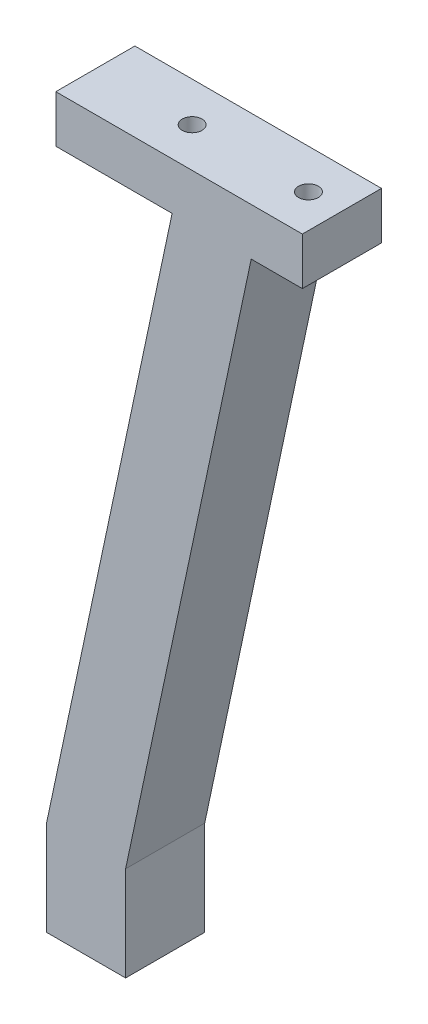
ISO-10303-21;
HEADER;
FILE_DESCRIPTION(('STEP AP214'),'2;1');
FILE_NAME('part.step','',(''),(''),'','','');
FILE_SCHEMA(('AUTOMOTIVE_DESIGN { 1 0 10303 214 1 1 1 1 }'));
ENDSEC;
DATA;
#1=APPLICATION_CONTEXT('core data for automotive mechanical design processes');
#2=APPLICATION_PROTOCOL_DEFINITION('international standard','automotive_design',2000,#1);
#3=PRODUCT_CONTEXT('',#1,'mechanical');
#4=PRODUCT('Part','Part','',(#3));
#5=PRODUCT_RELATED_PRODUCT_CATEGORY('part','',(#4));
#6=PRODUCT_DEFINITION_FORMATION('','',#4);
#7=PRODUCT_DEFINITION_CONTEXT('part definition',#1,'design');
#8=PRODUCT_DEFINITION('design','',#6,#7);
#9=PRODUCT_DEFINITION_SHAPE('','',#8);
#10=(LENGTH_UNIT() NAMED_UNIT(*) SI_UNIT(.MILLI.,.METRE.));
#11=(NAMED_UNIT(*) PLANE_ANGLE_UNIT() SI_UNIT($,.RADIAN.));
#12=(NAMED_UNIT(*) SI_UNIT($,.STERADIAN.) SOLID_ANGLE_UNIT());
#13=UNCERTAINTY_MEASURE_WITH_UNIT(LENGTH_MEASURE(1.E-05),#10,'distance_accuracy_value','');
#14=(GEOMETRIC_REPRESENTATION_CONTEXT(3) GLOBAL_UNCERTAINTY_ASSIGNED_CONTEXT((#13)) GLOBAL_UNIT_ASSIGNED_CONTEXT((#10,
#11,#12)) REPRESENTATION_CONTEXT('',''));
#15=CARTESIAN_POINT('',(0.,0.,0.));
#16=DIRECTION('',(0.,0.,1.));
#17=DIRECTION('',(1.,0.,0.));
#18=AXIS2_PLACEMENT_3D('',#15,#16,#17);
#19=CARTESIAN_POINT('',(36.8942820549233,137.16,-0.898563085800958));
#20=DIRECTION('',(0.,-1.,0.));
#21=DIRECTION('',(0.,0.,-1.));
#22=AXIS2_PLACEMENT_3D('',#19,#20,#21);
#23=CYLINDRICAL_SURFACE('',#22,2.125);
#24=CARTESIAN_POINT('',(36.8942820549233,137.16,-0.898563085800958));
#25=DIRECTION('',(0.,-1.,0.));
#26=DIRECTION('',(0.,0.,-1.));
#27=AXIS2_PLACEMENT_3D('',#24,#25,#26);
#28=CIRCLE('',#27,2.125);
#29=CARTESIAN_POINT('',(36.8942820549233,137.16,-3.02356308580096));
#30=VERTEX_POINT('',#29);
#31=EDGE_CURVE('E245',#30,#30,#28,.T.);
#32=ORIENTED_EDGE('',*,*,#31,.F.);
#33=EDGE_LOOP('',(#32));
#34=FACE_BOUND('',#33,.T.);
#35=CARTESIAN_POINT('',(36.8942820549233,130.,-0.898563085800958));
#36=DIRECTION('',(0.,-1.,0.));
#37=DIRECTION('',(0.,0.,-1.));
#38=AXIS2_PLACEMENT_3D('',#35,#36,#37);
#39=CIRCLE('',#38,2.125);
#40=CARTESIAN_POINT('',(36.8942820549233,130.,-3.02356308580096));
#41=VERTEX_POINT('',#40);
#42=EDGE_CURVE('E232',#41,#41,#39,.F.);
#43=ORIENTED_EDGE('',*,*,#42,.F.);
#44=EDGE_LOOP('',(#43));
#45=FACE_BOUND('',#44,.T.);
#46=ADVANCED_FACE('F34',(#34,#45),#23,.F.);
#47=CARTESIAN_POINT('',(11.8942820549233,137.16,-0.898563085800958));
#48=DIRECTION('',(0.,-1.,0.));
#49=DIRECTION('',(0.,0.,-1.));
#50=AXIS2_PLACEMENT_3D('',#47,#48,#49);
#51=CYLINDRICAL_SURFACE('',#50,2.125);
#52=CARTESIAN_POINT('',(11.8942820549233,137.16,-0.898563085800958));
#53=DIRECTION('',(0.,-1.,0.));
#54=DIRECTION('',(0.,0.,-1.));
#55=AXIS2_PLACEMENT_3D('',#52,#53,#54);
#56=CIRCLE('',#55,2.125);
#57=CARTESIAN_POINT('',(11.8942820549233,137.16,-3.02356308580096));
#58=VERTEX_POINT('',#57);
#59=EDGE_CURVE('E242',#58,#58,#56,.T.);
#60=ORIENTED_EDGE('',*,*,#59,.F.);
#61=EDGE_LOOP('',(#60));
#62=FACE_BOUND('',#61,.T.);
#63=CARTESIAN_POINT('',(11.8942820549233,130.,-0.898563085800958));
#64=DIRECTION('',(0.,-1.,0.));
#65=DIRECTION('',(0.,0.,-1.));
#66=AXIS2_PLACEMENT_3D('',#63,#64,#65);
#67=CIRCLE('',#66,2.125);
#68=CARTESIAN_POINT('',(11.8942820549233,130.,-3.02356308580096));
#69=VERTEX_POINT('',#68);
#70=EDGE_CURVE('E238',#69,#69,#67,.F.);
#71=ORIENTED_EDGE('',*,*,#70,.F.);
#72=EDGE_LOOP('',(#71));
#73=FACE_BOUND('',#72,.T.);
#74=ADVANCED_FACE('F359',(#62,#73),#51,.F.);
#75=CARTESIAN_POINT('',(16.0942820549233,127.,-9.39856308580096));
#76=DIRECTION('',(0.978147600733806,-0.207911690817756,0.));
#77=DIRECTION('',(0.207911690817756,0.978147600733806,0.));
#78=AXIS2_PLACEMENT_3D('',#75,#76,#77);
#79=PLANE('',#78);
#80=DIRECTION('',(0.,0.,1.));
#81=VECTOR('',#80,1.);
#82=CARTESIAN_POINT('',(16.0942820549233,127.,-9.39856308580096));
#83=LINE('',#82,#81);
#84=CARTESIAN_POINT('',(16.0942820549233,127.,1.10143691419904));
#85=VERTEX_POINT('',#84);
#86=CARTESIAN_POINT('',(16.0942820549233,127.,7.60143691419904));
#87=VERTEX_POINT('',#86);
#88=EDGE_CURVE('E38',#85,#87,#83,.T.);
#89=ORIENTED_EDGE('',*,*,#88,.F.);
#90=DIRECTION('',(0.207911690817756,0.978147600733806,0.));
#91=VECTOR('',#90,1.);
#92=CARTESIAN_POINT('',(16.0942820549233,127.,1.10143691419904));
#93=LINE('',#92,#91);
#94=CARTESIAN_POINT('',(11.9360482385682,107.437047985324,1.10143691419904));
#95=VERTEX_POINT('',#94);
#96=EDGE_CURVE('E53',#95,#85,#93,.T.);
#97=ORIENTED_EDGE('',*,*,#96,.F.);
#98=DIRECTION('',(0.,0.,1.));
#99=VECTOR('',#98,1.);
#100=CARTESIAN_POINT('',(11.9360482385682,107.437047985324,1.10143691419904));
#101=LINE('',#100,#99);
#102=CARTESIAN_POINT('',(11.9360482385682,107.437047985324,-2.89856308580096));
#103=VERTEX_POINT('',#102);
#104=EDGE_CURVE('E204',#103,#95,#101,.T.);
#105=ORIENTED_EDGE('',*,*,#104,.F.);
#106=DIRECTION('',(-0.207911690817756,-0.978147600733806,0.));
#107=VECTOR('',#106,1.);
#108=CARTESIAN_POINT('',(16.0942820549233,127.,-2.89856308580096));
#109=LINE('',#108,#107);
#110=CARTESIAN_POINT('',(16.0942820549233,127.,-2.89856308580096));
#111=VERTEX_POINT('',#110);
#112=EDGE_CURVE('E216',#111,#103,#109,.T.);
#113=ORIENTED_EDGE('',*,*,#112,.F.);
#114=CARTESIAN_POINT('',(16.0942820549233,127.,-9.39856308580096));
#115=VERTEX_POINT('',#114);
#116=EDGE_CURVE('E338',#115,#111,#83,.T.);
#117=ORIENTED_EDGE('',*,*,#116,.F.);
#118=DIRECTION('',(-0.207911690817756,-0.978147600733806,0.));
#119=VECTOR('',#118,1.);
#120=CARTESIAN_POINT('',(16.0942820549233,127.,-9.39856308580096));
#121=LINE('',#120,#119);
#122=CARTESIAN_POINT('',(-10.900401277169,0.,-9.39856308580096));
#123=VERTEX_POINT('',#122);
#124=EDGE_CURVE('E62',#115,#123,#121,.T.);
#125=ORIENTED_EDGE('',*,*,#124,.T.);
#126=DIRECTION('',(0.,0.,1.));
#127=VECTOR('',#126,1.);
#128=CARTESIAN_POINT('',(-10.900401277169,0.,-9.39856308580096));
#129=LINE('',#128,#127);
#130=CARTESIAN_POINT('',(-10.900401277169,0.,7.60143691419904));
#131=VERTEX_POINT('',#130);
#132=EDGE_CURVE('E193',#123,#131,#129,.T.);
#133=ORIENTED_EDGE('',*,*,#132,.T.);
#134=DIRECTION('',(-0.207911690817756,-0.978147600733806,0.));
#135=VECTOR('',#134,1.);
#136=CARTESIAN_POINT('',(16.0942820549233,127.,7.60143691419904));
#137=LINE('',#136,#135);
#138=EDGE_CURVE('E11',#87,#131,#137,.T.);
#139=ORIENTED_EDGE('',*,*,#138,.F.);
#140=EDGE_LOOP('',(#89,#97,#105,#113,#117,#125,#133,#139));
#141=FACE_BOUND('',#140,.T.);
#142=ADVANCED_FACE('F36',(#141),#79,.F.);
#143=CARTESIAN_POINT('',(16.0942820549233,127.,7.60143691419904));
#144=DIRECTION('',(0.,0.,-1.));
#145=DIRECTION('',(-1.,0.,0.));
#146=AXIS2_PLACEMENT_3D('',#143,#144,#145);
#147=PLANE('',#146);
#148=ORIENTED_EDGE('',*,*,#138,.T.);
#149=DIRECTION('',(0.,1.,0.));
#150=VECTOR('',#149,1.);
#151=CARTESIAN_POINT('',(-10.900401277169,-20.32,7.60143691419904));
#152=LINE('',#151,#150);
#153=CARTESIAN_POINT('',(-10.900401277169,-20.32,7.60143691419904));
#154=VERTEX_POINT('',#153);
#155=EDGE_CURVE('E419',#154,#131,#152,.T.);
#156=ORIENTED_EDGE('',*,*,#155,.F.);
#157=DIRECTION('',(-1.,0.,0.));
#158=VECTOR('',#157,1.);
#159=CARTESIAN_POINT('',(-10.900401277169,-20.32,7.60143691419904));
#160=LINE('',#159,#158);
#161=CARTESIAN_POINT('',(6.09959872283096,-20.32,7.60143691419904));
#162=VERTEX_POINT('',#161);
#163=EDGE_CURVE('E186',#162,#154,#160,.T.);
#164=ORIENTED_EDGE('',*,*,#163,.F.);
#165=DIRECTION('',(0.,1.,0.));
#166=VECTOR('',#165,1.);
#167=CARTESIAN_POINT('',(6.09959872283096,-20.32,7.60143691419904));
#168=LINE('',#167,#166);
#169=CARTESIAN_POINT('',(6.09959872283096,0.,7.60143691419904));
#170=VERTEX_POINT('',#169);
#171=EDGE_CURVE('E74',#162,#170,#168,.T.);
#172=ORIENTED_EDGE('',*,*,#171,.T.);
#173=DIRECTION('',(-0.207911690817756,-0.978147600733806,0.));
#174=VECTOR('',#173,1.);
#175=CARTESIAN_POINT('',(33.0942820549233,127.,7.60143691419904));
#176=LINE('',#175,#174);
#177=CARTESIAN_POINT('',(33.0942820549233,127.,7.60143691419904));
#178=VERTEX_POINT('',#177);
#179=EDGE_CURVE('E45',#178,#170,#176,.T.);
#180=ORIENTED_EDGE('',*,*,#179,.F.);
#181=DIRECTION('',(1.,0.,0.));
#182=VECTOR('',#181,1.);
#183=CARTESIAN_POINT('',(-8.9057179450767,127.,7.60143691419904));
#184=LINE('',#183,#182);
#185=CARTESIAN_POINT('',(44.0942820549233,127.,7.60143691419904));
#186=VERTEX_POINT('',#185);
#187=EDGE_CURVE('E298',#178,#186,#184,.T.);
#188=ORIENTED_EDGE('',*,*,#187,.T.);
#189=DIRECTION('',(0.,-1.,0.));
#190=VECTOR('',#189,1.);
#191=CARTESIAN_POINT('',(44.0942820549233,137.16,7.60143691419904));
#192=LINE('',#191,#190);
#193=CARTESIAN_POINT('',(44.0942820549233,137.16,7.60143691419904));
#194=VERTEX_POINT('',#193);
#195=EDGE_CURVE('E320',#194,#186,#192,.T.);
#196=ORIENTED_EDGE('',*,*,#195,.F.);
#197=DIRECTION('',(1.,0.,0.));
#198=VECTOR('',#197,1.);
#199=CARTESIAN_POINT('',(-8.9057179450767,137.16,7.60143691419904));
#200=LINE('',#199,#198);
#201=CARTESIAN_POINT('',(-8.9057179450767,137.16,7.60143691419904));
#202=VERTEX_POINT('',#201);
#203=EDGE_CURVE('E288',#202,#194,#200,.T.);
#204=ORIENTED_EDGE('',*,*,#203,.F.);
#205=DIRECTION('',(0.,-1.,0.));
#206=VECTOR('',#205,1.);
#207=CARTESIAN_POINT('',(-8.9057179450767,137.16,7.60143691419904));
#208=LINE('',#207,#206);
#209=CARTESIAN_POINT('',(-8.9057179450767,127.,7.60143691419904));
#210=VERTEX_POINT('',#209);
#211=EDGE_CURVE('E322',#202,#210,#208,.T.);
#212=ORIENTED_EDGE('',*,*,#211,.T.);
#213=EDGE_CURVE('E306',#210,#87,#184,.T.);
#214=ORIENTED_EDGE('',*,*,#213,.T.);
#215=EDGE_LOOP('',(#148,#156,#164,#172,#180,#188,#196,#204,#212,#214));
#216=FACE_BOUND('',#215,.T.);
#217=ADVANCED_FACE('F414',(#216),#147,.F.);
#218=CARTESIAN_POINT('',(33.0942820549233,127.,-9.39856308580096));
#219=DIRECTION('',(-0.978147600733806,0.207911690817756,0.));
#220=DIRECTION('',(-0.207911690817756,-0.978147600733806,0.));
#221=AXIS2_PLACEMENT_3D('',#218,#219,#220);
#222=PLANE('',#221);
#223=DIRECTION('',(0.,0.,-1.));
#224=VECTOR('',#223,1.);
#225=CARTESIAN_POINT('',(6.09959872283096,0.,-9.39856308580096));
#226=LINE('',#225,#224);
#227=CARTESIAN_POINT('',(6.09959872283096,0.,-9.39856308580096));
#228=VERTEX_POINT('',#227);
#229=EDGE_CURVE('E325',#170,#228,#226,.T.);
#230=ORIENTED_EDGE('',*,*,#229,.T.);
#231=DIRECTION('',(-0.207911690817756,-0.978147600733806,0.));
#232=VECTOR('',#231,1.);
#233=CARTESIAN_POINT('',(33.0942820549233,127.,-9.39856308580096));
#234=LINE('',#233,#232);
#235=CARTESIAN_POINT('',(33.0942820549233,127.,-9.39856308580096));
#236=VERTEX_POINT('',#235);
#237=EDGE_CURVE('E84',#236,#228,#234,.T.);
#238=ORIENTED_EDGE('',*,*,#237,.F.);
#239=DIRECTION('',(0.,0.,-1.));
#240=VECTOR('',#239,1.);
#241=CARTESIAN_POINT('',(33.0942820549233,127.,-9.39856308580096));
#242=LINE('',#241,#240);
#243=EDGE_CURVE('E336',#178,#236,#242,.T.);
#244=ORIENTED_EDGE('',*,*,#243,.F.);
#245=ORIENTED_EDGE('',*,*,#179,.T.);
#246=EDGE_LOOP('',(#230,#238,#244,#245));
#247=FACE_BOUND('',#246,.T.);
#248=ADVANCED_FACE('F412',(#247),#222,.F.);
#249=CARTESIAN_POINT('',(16.0942820549233,127.,-9.39856308580096));
#250=DIRECTION('',(0.,0.,1.));
#251=DIRECTION('',(1.,0.,0.));
#252=AXIS2_PLACEMENT_3D('',#249,#250,#251);
#253=PLANE('',#252);
#254=ORIENTED_EDGE('',*,*,#237,.T.);
#255=DIRECTION('',(0.,1.,0.));
#256=VECTOR('',#255,1.);
#257=CARTESIAN_POINT('',(6.09959872283096,-20.32,-9.39856308580096));
#258=LINE('',#257,#256);
#259=CARTESIAN_POINT('',(6.09959872283096,-20.32,-9.39856308580096));
#260=VERTEX_POINT('',#259);
#261=EDGE_CURVE('E178',#260,#228,#258,.T.);
#262=ORIENTED_EDGE('',*,*,#261,.F.);
#263=DIRECTION('',(1.,0.,0.));
#264=VECTOR('',#263,1.);
#265=CARTESIAN_POINT('',(-10.900401277169,-20.32,-9.39856308580096));
#266=LINE('',#265,#264);
#267=CARTESIAN_POINT('',(-10.900401277169,-20.32,-9.39856308580096));
#268=VERTEX_POINT('',#267);
#269=EDGE_CURVE('E172',#268,#260,#266,.T.);
#270=ORIENTED_EDGE('',*,*,#269,.F.);
#271=DIRECTION('',(0.,1.,0.));
#272=VECTOR('',#271,1.);
#273=CARTESIAN_POINT('',(-10.900401277169,-20.32,-9.39856308580096));
#274=LINE('',#273,#272);
#275=EDGE_CURVE('E176',#268,#123,#274,.T.);
#276=ORIENTED_EDGE('',*,*,#275,.T.);
#277=ORIENTED_EDGE('',*,*,#124,.F.);
#278=DIRECTION('',(-1.,0.,0.));
#279=VECTOR('',#278,1.);
#280=CARTESIAN_POINT('',(-8.9057179450767,127.,-9.39856308580096));
#281=LINE('',#280,#279);
#282=CARTESIAN_POINT('',(-8.9057179450767,127.,-9.39856308580096));
#283=VERTEX_POINT('',#282);
#284=EDGE_CURVE('E309',#115,#283,#281,.T.);
#285=ORIENTED_EDGE('',*,*,#284,.T.);
#286=DIRECTION('',(0.,-1.,0.));
#287=VECTOR('',#286,1.);
#288=CARTESIAN_POINT('',(-8.9057179450767,137.16,-9.39856308580096));
#289=LINE('',#288,#287);
#290=CARTESIAN_POINT('',(-8.9057179450767,137.16,-9.39856308580096));
#291=VERTEX_POINT('',#290);
#292=EDGE_CURVE('E295',#291,#283,#289,.T.);
#293=ORIENTED_EDGE('',*,*,#292,.F.);
#294=DIRECTION('',(-1.,0.,0.));
#295=VECTOR('',#294,1.);
#296=CARTESIAN_POINT('',(-8.9057179450767,137.16,-9.39856308580096));
#297=LINE('',#296,#295);
#298=CARTESIAN_POINT('',(44.0942820549233,137.16,-9.39856308580096));
#299=VERTEX_POINT('',#298);
#300=EDGE_CURVE('E293',#299,#291,#297,.T.);
#301=ORIENTED_EDGE('',*,*,#300,.F.);
#302=DIRECTION('',(0.,-1.,0.));
#303=VECTOR('',#302,1.);
#304=CARTESIAN_POINT('',(44.0942820549233,137.16,-9.39856308580096));
#305=LINE('',#304,#303);
#306=CARTESIAN_POINT('',(44.0942820549233,127.,-9.39856308580096));
#307=VERTEX_POINT('',#306);
#308=EDGE_CURVE('E317',#299,#307,#305,.T.);
#309=ORIENTED_EDGE('',*,*,#308,.T.);
#310=EDGE_CURVE('E289',#307,#236,#281,.T.);
#311=ORIENTED_EDGE('',*,*,#310,.T.);
#312=EDGE_LOOP('',(#254,#262,#270,#276,#277,#285,#293,#301,#309,#311));
#313=FACE_BOUND('',#312,.T.);
#314=ADVANCED_FACE('F174',(#313),#253,.F.);
#315=CARTESIAN_POINT('',(0.,127.,0.));
#316=DIRECTION('',(0.,1.,0.));
#317=DIRECTION('',(0.,0.,1.));
#318=AXIS2_PLACEMENT_3D('',#315,#316,#317);
#319=PLANE('',#318);
#320=CARTESIAN_POINT('',(11.8942820549233,127.,-0.898563085800958));
#321=DIRECTION('',(0.,-1.,0.));
#322=DIRECTION('',(0.,0.,-1.));
#323=AXIS2_PLACEMENT_3D('',#320,#321,#322);
#324=CIRCLE('',#323,3.3);
#325=CARTESIAN_POINT('',(11.8942820549233,127.,-4.19856308580096));
#326=VERTEX_POINT('',#325);
#327=EDGE_CURVE('E239',#326,#326,#324,.T.);
#328=ORIENTED_EDGE('',*,*,#327,.F.);
#329=EDGE_LOOP('',(#328));
#330=FACE_BOUND('',#329,.T.);
#331=ORIENTED_EDGE('',*,*,#284,.F.);
#332=ORIENTED_EDGE('',*,*,#116,.T.);
#333=DIRECTION('',(0.,0.,-1.));
#334=VECTOR('',#333,1.);
#335=CARTESIAN_POINT('',(16.0942820549233,127.,1.10143691419904));
#336=LINE('',#335,#334);
#337=EDGE_CURVE('E195',#85,#111,#336,.T.);
#338=ORIENTED_EDGE('',*,*,#337,.F.);
#339=ORIENTED_EDGE('',*,*,#88,.T.);
#340=ORIENTED_EDGE('',*,*,#213,.F.);
#341=DIRECTION('',(0.,0.,1.));
#342=VECTOR('',#341,1.);
#343=CARTESIAN_POINT('',(-8.9057179450767,127.,-9.39856308580096));
#344=LINE('',#343,#342);
#345=EDGE_CURVE('E276',#283,#210,#344,.T.);
#346=ORIENTED_EDGE('',*,*,#345,.F.);
#347=EDGE_LOOP('',(#331,#332,#338,#339,#340,#346));
#348=FACE_BOUND('',#347,.T.);
#349=ADVANCED_FACE('F398',(#330,#348),#319,.F.);
#350=CARTESIAN_POINT('',(36.8942820549233,127.,-0.898563085800958));
#351=DIRECTION('',(0.,-1.,0.));
#352=DIRECTION('',(0.,0.,-1.));
#353=AXIS2_PLACEMENT_3D('',#350,#351,#352);
#354=CIRCLE('',#353,3.3);
#355=CARTESIAN_POINT('',(36.8942820549233,127.,-4.19856308580096));
#356=VERTEX_POINT('',#355);
#357=EDGE_CURVE('E223',#356,#356,#354,.T.);
#358=ORIENTED_EDGE('',*,*,#357,.F.);
#359=EDGE_LOOP('',(#358));
#360=FACE_BOUND('',#359,.T.);
#361=ORIENTED_EDGE('',*,*,#187,.F.);
#362=ORIENTED_EDGE('',*,*,#243,.T.);
#363=ORIENTED_EDGE('',*,*,#310,.F.);
#364=DIRECTION('',(0.,0.,-1.));
#365=VECTOR('',#364,1.);
#366=CARTESIAN_POINT('',(44.0942820549233,127.,-9.39856308580096));
#367=LINE('',#366,#365);
#368=EDGE_CURVE('E301',#186,#307,#367,.T.);
#369=ORIENTED_EDGE('',*,*,#368,.F.);
#370=EDGE_LOOP('',(#361,#362,#363,#369));
#371=FACE_BOUND('',#370,.T.);
#372=ADVANCED_FACE('F401',(#360,#371),#319,.F.);
#373=CARTESIAN_POINT('',(-8.9057179450767,137.16,-9.39856308580096));
#374=DIRECTION('',(1.,0.,0.));
#375=DIRECTION('',(0.,0.,-1.));
#376=AXIS2_PLACEMENT_3D('',#373,#374,#375);
#377=PLANE('',#376);
#378=ORIENTED_EDGE('',*,*,#345,.T.);
#379=ORIENTED_EDGE('',*,*,#211,.F.);
#380=DIRECTION('',(0.,0.,1.));
#381=VECTOR('',#380,1.);
#382=CARTESIAN_POINT('',(-8.9057179450767,137.16,-9.39856308580096));
#383=LINE('',#382,#381);
#384=EDGE_CURVE('E285',#291,#202,#383,.T.);
#385=ORIENTED_EDGE('',*,*,#384,.F.);
#386=ORIENTED_EDGE('',*,*,#292,.T.);
#387=EDGE_LOOP('',(#378,#379,#385,#386));
#388=FACE_BOUND('',#387,.T.);
#389=ADVANCED_FACE('F405',(#388),#377,.F.);
#390=CARTESIAN_POINT('',(44.0942820549233,137.16,-9.39856308580096));
#391=DIRECTION('',(-1.,0.,0.));
#392=DIRECTION('',(0.,0.,1.));
#393=AXIS2_PLACEMENT_3D('',#390,#391,#392);
#394=PLANE('',#393);
#395=ORIENTED_EDGE('',*,*,#368,.T.);
#396=ORIENTED_EDGE('',*,*,#308,.F.);
#397=DIRECTION('',(0.,0.,-1.));
#398=VECTOR('',#397,1.);
#399=CARTESIAN_POINT('',(44.0942820549233,137.16,-9.39856308580096));
#400=LINE('',#399,#398);
#401=EDGE_CURVE('E291',#194,#299,#400,.T.);
#402=ORIENTED_EDGE('',*,*,#401,.F.);
#403=ORIENTED_EDGE('',*,*,#195,.T.);
#404=EDGE_LOOP('',(#395,#396,#402,#403));
#405=FACE_BOUND('',#404,.T.);
#406=ADVANCED_FACE('F396',(#405),#394,.F.);
#407=CARTESIAN_POINT('',(0.,137.16,0.));
#408=DIRECTION('',(0.,1.,0.));
#409=DIRECTION('',(0.,0.,1.));
#410=AXIS2_PLACEMENT_3D('',#407,#408,#409);
#411=PLANE('',#410);
#412=ORIENTED_EDGE('',*,*,#59,.T.);
#413=EDGE_LOOP('',(#412));
#414=FACE_BOUND('',#413,.T.);
#415=ORIENTED_EDGE('',*,*,#31,.T.);
#416=EDGE_LOOP('',(#415));
#417=FACE_BOUND('',#416,.T.);
#418=ORIENTED_EDGE('',*,*,#384,.T.);
#419=ORIENTED_EDGE('',*,*,#203,.T.);
#420=ORIENTED_EDGE('',*,*,#401,.T.);
#421=ORIENTED_EDGE('',*,*,#300,.T.);
#422=EDGE_LOOP('',(#418,#419,#420,#421));
#423=FACE_BOUND('',#422,.T.);
#424=ADVANCED_FACE('F392',(#414,#417,#423),#411,.T.);
#425=CARTESIAN_POINT('',(11.8942820549233,130.,-0.898563085800958));
#426=DIRECTION('',(0.,-1.,0.));
#427=DIRECTION('',(0.,0.,-1.));
#428=AXIS2_PLACEMENT_3D('',#425,#426,#427);
#429=PLANE('',#428);
#430=CARTESIAN_POINT('',(11.8942820549233,130.,-0.898563085800958));
#431=DIRECTION('',(0.,-1.,0.));
#432=DIRECTION('',(0.,0.,-1.));
#433=AXIS2_PLACEMENT_3D('',#430,#431,#432);
#434=CIRCLE('',#433,3.3);
#435=CARTESIAN_POINT('',(11.8942820549233,130.,-4.19856308580096));
#436=VERTEX_POINT('',#435);
#437=EDGE_CURVE('E235',#436,#436,#434,.T.);
#438=ORIENTED_EDGE('',*,*,#437,.T.);
#439=EDGE_LOOP('',(#438));
#440=FACE_BOUND('',#439,.T.);
#441=ORIENTED_EDGE('',*,*,#70,.T.);
#442=EDGE_LOOP('',(#441));
#443=FACE_BOUND('',#442,.T.);
#444=ADVANCED_FACE('F395',(#440,#443),#429,.T.);
#445=CARTESIAN_POINT('',(11.8942820549233,130.,-0.898563085800958));
#446=DIRECTION('',(0.,-1.,0.));
#447=DIRECTION('',(0.,0.,-1.));
#448=AXIS2_PLACEMENT_3D('',#445,#446,#447);
#449=CYLINDRICAL_SURFACE('',#448,3.3);
#450=ORIENTED_EDGE('',*,*,#437,.F.);
#451=EDGE_LOOP('',(#450));
#452=FACE_BOUND('',#451,.T.);
#453=ORIENTED_EDGE('',*,*,#327,.T.);
#454=EDGE_LOOP('',(#453));
#455=FACE_BOUND('',#454,.T.);
#456=ADVANCED_FACE('F455',(#452,#455),#449,.F.);
#457=CARTESIAN_POINT('',(36.8942820549233,130.,-0.898563085800958));
#458=DIRECTION('',(0.,-1.,0.));
#459=DIRECTION('',(0.,0.,-1.));
#460=AXIS2_PLACEMENT_3D('',#457,#458,#459);
#461=PLANE('',#460);
#462=CARTESIAN_POINT('',(36.8942820549233,130.,-0.898563085800958));
#463=DIRECTION('',(0.,-1.,0.));
#464=DIRECTION('',(0.,0.,-1.));
#465=AXIS2_PLACEMENT_3D('',#462,#463,#464);
#466=CIRCLE('',#465,3.3);
#467=CARTESIAN_POINT('',(36.8942820549233,130.,-4.19856308580096));
#468=VERTEX_POINT('',#467);
#469=EDGE_CURVE('E229',#468,#468,#466,.T.);
#470=ORIENTED_EDGE('',*,*,#469,.T.);
#471=EDGE_LOOP('',(#470));
#472=FACE_BOUND('',#471,.T.);
#473=ORIENTED_EDGE('',*,*,#42,.T.);
#474=EDGE_LOOP('',(#473));
#475=FACE_BOUND('',#474,.T.);
#476=ADVANCED_FACE('F356',(#472,#475),#461,.T.);
#477=CARTESIAN_POINT('',(36.8942820549233,130.,-0.898563085800958));
#478=DIRECTION('',(0.,-1.,0.));
#479=DIRECTION('',(0.,0.,-1.));
#480=AXIS2_PLACEMENT_3D('',#477,#478,#479);
#481=CYLINDRICAL_SURFACE('',#480,3.3);
#482=ORIENTED_EDGE('',*,*,#469,.F.);
#483=EDGE_LOOP('',(#482));
#484=FACE_BOUND('',#483,.T.);
#485=ORIENTED_EDGE('',*,*,#357,.T.);
#486=EDGE_LOOP('',(#485));
#487=FACE_BOUND('',#486,.T.);
#488=ADVANCED_FACE('F446',(#484,#487),#481,.F.);
#489=CARTESIAN_POINT('',(18.0505772563909,126.584176618365,1.10143691419904));
#490=DIRECTION('',(0.,0.,1.));
#491=DIRECTION('',(0.,-1.,0.));
#492=AXIS2_PLACEMENT_3D('',#489,#490,#491);
#493=PLANE('',#492);
#494=ORIENTED_EDGE('',*,*,#96,.T.);
#495=DIRECTION('',(-0.978147600733806,0.207911690817756,0.));
#496=VECTOR('',#495,1.);
#497=CARTESIAN_POINT('',(18.0505772563909,126.584176618365,1.10143691419904));
#498=LINE('',#497,#496);
#499=CARTESIAN_POINT('',(18.0505772563909,126.584176618365,1.10143691419904));
#500=VERTEX_POINT('',#499);
#501=EDGE_CURVE('E212',#500,#85,#498,.T.);
#502=ORIENTED_EDGE('',*,*,#501,.F.);
#503=DIRECTION('',(0.207911690817756,0.978147600733806,0.));
#504=VECTOR('',#503,1.);
#505=CARTESIAN_POINT('',(18.0505772563909,126.584176618365,1.10143691419904));
#506=LINE('',#505,#504);
#507=CARTESIAN_POINT('',(13.8923434400358,107.021224603688,1.10143691419904));
#508=VERTEX_POINT('',#507);
#509=EDGE_CURVE('E200',#508,#500,#506,.T.);
#510=ORIENTED_EDGE('',*,*,#509,.F.);
#511=DIRECTION('',(-0.978147600733806,0.207911690817756,0.));
#512=VECTOR('',#511,1.);
#513=CARTESIAN_POINT('',(13.8923434400358,107.021224603688,1.10143691419904));
#514=LINE('',#513,#512);
#515=EDGE_CURVE('E221',#508,#95,#514,.T.);
#516=ORIENTED_EDGE('',*,*,#515,.T.);
#517=EDGE_LOOP('',(#494,#502,#510,#516));
#518=FACE_BOUND('',#517,.T.);
#519=ADVANCED_FACE('F436',(#518),#493,.F.);
#520=CARTESIAN_POINT('',(13.8923434400358,107.021224603688,1.10143691419904));
#521=DIRECTION('',(-0.207911690817756,-0.978147600733806,0.));
#522=DIRECTION('',(0.978147600733806,-0.207911690817756,0.));
#523=AXIS2_PLACEMENT_3D('',#520,#521,#522);
#524=PLANE('',#523);
#525=ORIENTED_EDGE('',*,*,#104,.T.);
#526=ORIENTED_EDGE('',*,*,#515,.F.);
#527=DIRECTION('',(0.,0.,1.));
#528=VECTOR('',#527,1.);
#529=CARTESIAN_POINT('',(13.8923434400358,107.021224603688,1.10143691419904));
#530=LINE('',#529,#528);
#531=CARTESIAN_POINT('',(13.8923434400358,107.021224603688,-2.89856308580096));
#532=VERTEX_POINT('',#531);
#533=EDGE_CURVE('E210',#532,#508,#530,.T.);
#534=ORIENTED_EDGE('',*,*,#533,.F.);
#535=DIRECTION('',(-0.978147600733806,0.207911690817756,0.));
#536=VECTOR('',#535,1.);
#537=CARTESIAN_POINT('',(13.8923434400358,107.021224603688,-2.89856308580096));
#538=LINE('',#537,#536);
#539=EDGE_CURVE('E224',#532,#103,#538,.T.);
#540=ORIENTED_EDGE('',*,*,#539,.T.);
#541=EDGE_LOOP('',(#525,#526,#534,#540));
#542=FACE_BOUND('',#541,.T.);
#543=ADVANCED_FACE('F438',(#542),#524,.F.);
#544=CARTESIAN_POINT('',(18.0505772563909,126.584176618365,-2.89856308580096));
#545=DIRECTION('',(0.,0.,-1.));
#546=DIRECTION('',(-1.,0.,0.));
#547=AXIS2_PLACEMENT_3D('',#544,#545,#546);
#548=PLANE('',#547);
#549=ORIENTED_EDGE('',*,*,#112,.T.);
#550=ORIENTED_EDGE('',*,*,#539,.F.);
#551=DIRECTION('',(-0.207911690817756,-0.978147600733806,0.));
#552=VECTOR('',#551,1.);
#553=CARTESIAN_POINT('',(18.0505772563909,126.584176618365,-2.89856308580096));
#554=LINE('',#553,#552);
#555=CARTESIAN_POINT('',(18.0505772563909,126.584176618365,-2.89856308580096));
#556=VERTEX_POINT('',#555);
#557=EDGE_CURVE('E207',#556,#532,#554,.T.);
#558=ORIENTED_EDGE('',*,*,#557,.F.);
#559=DIRECTION('',(-0.978147600733806,0.207911690817756,0.));
#560=VECTOR('',#559,1.);
#561=CARTESIAN_POINT('',(18.0505772563909,126.584176618365,-2.89856308580096));
#562=LINE('',#561,#560);
#563=EDGE_CURVE('E226',#556,#111,#562,.T.);
#564=ORIENTED_EDGE('',*,*,#563,.T.);
#565=EDGE_LOOP('',(#549,#550,#558,#564));
#566=FACE_BOUND('',#565,.T.);
#567=ADVANCED_FACE('F431',(#566),#548,.F.);
#568=CARTESIAN_POINT('',(18.0505772563909,126.584176618365,1.10143691419904));
#569=DIRECTION('',(0.207911690817756,0.978147600733806,0.));
#570=DIRECTION('',(-0.978147600733806,0.207911690817756,0.));
#571=AXIS2_PLACEMENT_3D('',#568,#569,#570);
#572=PLANE('',#571);
#573=ORIENTED_EDGE('',*,*,#337,.T.);
#574=ORIENTED_EDGE('',*,*,#563,.F.);
#575=DIRECTION('',(0.,0.,-1.));
#576=VECTOR('',#575,1.);
#577=CARTESIAN_POINT('',(18.0505772563909,126.584176618365,1.10143691419904));
#578=LINE('',#577,#576);
#579=EDGE_CURVE('E203',#500,#556,#578,.T.);
#580=ORIENTED_EDGE('',*,*,#579,.F.);
#581=ORIENTED_EDGE('',*,*,#501,.T.);
#582=EDGE_LOOP('',(#573,#574,#580,#581));
#583=FACE_BOUND('',#582,.T.);
#584=ADVANCED_FACE('F427',(#583),#572,.F.);
#585=CARTESIAN_POINT('',(-8.47291147373662,1.8009729301919,0.));
#586=DIRECTION('',(0.978147600733806,-0.207911690817756,0.));
#587=DIRECTION('',(0.207911690817756,0.978147600733806,0.));
#588=AXIS2_PLACEMENT_3D('',#585,#586,#587);
#589=PLANE('',#588);
#590=ORIENTED_EDGE('',*,*,#509,.T.);
#591=ORIENTED_EDGE('',*,*,#579,.T.);
#592=ORIENTED_EDGE('',*,*,#557,.T.);
#593=ORIENTED_EDGE('',*,*,#533,.T.);
#594=EDGE_LOOP('',(#590,#591,#592,#593));
#595=FACE_BOUND('',#594,.T.);
#596=ADVANCED_FACE('F434',(#595),#589,.F.);
#597=CARTESIAN_POINT('',(-10.900401277169,-20.32,7.60143691419904));
#598=DIRECTION('',(1.,0.,0.));
#599=DIRECTION('',(0.,0.,-1.));
#600=AXIS2_PLACEMENT_3D('',#597,#598,#599);
#601=PLANE('',#600);
#602=ORIENTED_EDGE('',*,*,#132,.F.);
#603=ORIENTED_EDGE('',*,*,#275,.F.);
#604=DIRECTION('',(0.,0.,-1.));
#605=VECTOR('',#604,1.);
#606=CARTESIAN_POINT('',(-10.900401277169,-20.32,7.60143691419904));
#607=LINE('',#606,#605);
#608=EDGE_CURVE('E182',#154,#268,#607,.T.);
#609=ORIENTED_EDGE('',*,*,#608,.F.);
#610=ORIENTED_EDGE('',*,*,#155,.T.);
#611=EDGE_LOOP('',(#602,#603,#609,#610));
#612=FACE_BOUND('',#611,.T.);
#613=ADVANCED_FACE('F191',(#612),#601,.F.);
#614=CARTESIAN_POINT('',(6.09959872283096,-20.32,7.60143691419904));
#615=DIRECTION('',(-1.,0.,0.));
#616=DIRECTION('',(0.,0.,1.));
#617=AXIS2_PLACEMENT_3D('',#614,#615,#616);
#618=PLANE('',#617);
#619=ORIENTED_EDGE('',*,*,#229,.F.);
#620=ORIENTED_EDGE('',*,*,#171,.F.);
#621=DIRECTION('',(0.,0.,1.));
#622=VECTOR('',#621,1.);
#623=CARTESIAN_POINT('',(6.09959872283096,-20.32,7.60143691419904));
#624=LINE('',#623,#622);
#625=EDGE_CURVE('E181',#260,#162,#624,.T.);
#626=ORIENTED_EDGE('',*,*,#625,.F.);
#627=ORIENTED_EDGE('',*,*,#261,.T.);
#628=EDGE_LOOP('',(#619,#620,#626,#627));
#629=FACE_BOUND('',#628,.T.);
#630=ADVANCED_FACE('F547',(#629),#618,.F.);
#631=CARTESIAN_POINT('',(0.,-20.32,0.));
#632=DIRECTION('',(0.,-1.,0.));
#633=DIRECTION('',(0.,0.,-1.));
#634=AXIS2_PLACEMENT_3D('',#631,#632,#633);
#635=PLANE('',#634);
#636=CARTESIAN_POINT('',(-2.40040127716904,-20.32,-0.898563085800959));
#637=DIRECTION('',(0.,-1.,0.));
#638=DIRECTION('',(0.,0.,-1.));
#639=AXIS2_PLACEMENT_3D('',#636,#637,#638);
#640=CIRCLE('',#639,1.6764);
#641=CARTESIAN_POINT('',(-2.40040127716904,-20.32,-2.57496308580096));
#642=VERTEX_POINT('',#641);
#643=EDGE_CURVE('E702',#642,#642,#640,.T.);
#644=ORIENTED_EDGE('',*,*,#643,.F.);
#645=EDGE_LOOP('',(#644));
#646=FACE_BOUND('',#645,.T.);
#647=ORIENTED_EDGE('',*,*,#608,.T.);
#648=ORIENTED_EDGE('',*,*,#269,.T.);
#649=ORIENTED_EDGE('',*,*,#625,.T.);
#650=ORIENTED_EDGE('',*,*,#163,.T.);
#651=EDGE_LOOP('',(#647,#648,#649,#650));
#652=FACE_BOUND('',#651,.T.);
#653=ADVANCED_FACE('F185',(#646,#652),#635,.T.);
#654=CARTESIAN_POINT('',(-2.40040127716904,-5.08,-0.898563085800959));
#655=DIRECTION('',(0.,-1.,0.));
#656=DIRECTION('',(0.,0.,-1.));
#657=AXIS2_PLACEMENT_3D('',#654,#655,#656);
#658=CYLINDRICAL_SURFACE('',#657,1.6764);
#659=CARTESIAN_POINT('',(-2.40040127716904,-5.08,-0.898563085800959));
#660=DIRECTION('',(0.,-1.,0.));
#661=DIRECTION('',(0.,0.,-1.));
#662=AXIS2_PLACEMENT_3D('',#659,#660,#661);
#663=CIRCLE('',#662,1.6764);
#664=CARTESIAN_POINT('',(-2.40040127716904,-5.08,-2.57496308580096));
#665=VERTEX_POINT('',#664);
#666=EDGE_CURVE('E189',#665,#665,#663,.T.);
#667=CARTESIAN_POINT('',(-2.40040127716904,-5.08,-2.57496308580096));
#668=CARTESIAN_POINT('',(-2.40040127716904,-5.23875,-2.57496308580096));
#669=CARTESIAN_POINT('',(-2.40040127716904,-5.3975,-2.57496308580096));
#670=CARTESIAN_POINT('',(-2.40040127716904,-5.715,-2.57496308580096));
#671=CARTESIAN_POINT('',(-2.40040127716904,-5.87375,-2.57496308580096));
#672=CARTESIAN_POINT('',(-2.40040127716904,-6.19125,-2.57496308580096));
#673=CARTESIAN_POINT('',(-2.40040127716904,-6.35,-2.57496308580096));
#674=CARTESIAN_POINT('',(-2.40040127716904,-6.6675,-2.57496308580096));
#675=CARTESIAN_POINT('',(-2.40040127716904,-6.82625,-2.57496308580096));
#676=CARTESIAN_POINT('',(-2.40040127716904,-7.14375,-2.57496308580096));
#677=CARTESIAN_POINT('',(-2.40040127716904,-7.3025,-2.57496308580096));
#678=CARTESIAN_POINT('',(-2.40040127716904,-7.62,-2.57496308580096));
#679=CARTESIAN_POINT('',(-2.40040127716904,-7.77875,-2.57496308580096));
#680=CARTESIAN_POINT('',(-2.40040127716904,-8.09625,-2.57496308580096));
#681=CARTESIAN_POINT('',(-2.40040127716904,-8.255,-2.57496308580096));
#682=CARTESIAN_POINT('',(-2.40040127716904,-8.5725,-2.57496308580096));
#683=CARTESIAN_POINT('',(-2.40040127716904,-8.73125,-2.57496308580096));
#684=CARTESIAN_POINT('',(-2.40040127716904,-9.04875,-2.57496308580096));
#685=CARTESIAN_POINT('',(-2.40040127716904,-9.2075,-2.57496308580096));
#686=CARTESIAN_POINT('',(-2.40040127716904,-9.525,-2.57496308580096));
#687=CARTESIAN_POINT('',(-2.40040127716904,-9.68375,-2.57496308580096));
#688=CARTESIAN_POINT('',(-2.40040127716904,-10.00125,-2.57496308580096));
#689=CARTESIAN_POINT('',(-2.40040127716904,-10.16,-2.57496308580096));
#690=CARTESIAN_POINT('',(-2.40040127716904,-10.4775,-2.57496308580096));
#691=CARTESIAN_POINT('',(-2.40040127716904,-10.63625,-2.57496308580096));
#692=CARTESIAN_POINT('',(-2.40040127716904,-10.95375,-2.57496308580096));
#693=CARTESIAN_POINT('',(-2.40040127716904,-11.1125,-2.57496308580096));
#694=CARTESIAN_POINT('',(-2.40040127716904,-11.43,-2.57496308580096));
#695=CARTESIAN_POINT('',(-2.40040127716904,-11.58875,-2.57496308580096));
#696=CARTESIAN_POINT('',(-2.40040127716904,-11.90625,-2.57496308580096));
#697=CARTESIAN_POINT('',(-2.40040127716904,-12.065,-2.57496308580096));
#698=CARTESIAN_POINT('',(-2.40040127716904,-12.3825,-2.57496308580096));
#699=CARTESIAN_POINT('',(-2.40040127716904,-12.54125,-2.57496308580096));
#700=CARTESIAN_POINT('',(-2.40040127716904,-12.85875,-2.57496308580096));
#701=CARTESIAN_POINT('',(-2.40040127716904,-13.0175,-2.57496308580096));
#702=CARTESIAN_POINT('',(-2.40040127716904,-13.335,-2.57496308580096));
#703=CARTESIAN_POINT('',(-2.40040127716904,-13.49375,-2.57496308580096));
#704=CARTESIAN_POINT('',(-2.40040127716904,-13.81125,-2.57496308580096));
#705=CARTESIAN_POINT('',(-2.40040127716904,-13.97,-2.57496308580096));
#706=CARTESIAN_POINT('',(-2.40040127716904,-14.2875,-2.57496308580096));
#707=CARTESIAN_POINT('',(-2.40040127716904,-14.44625,-2.57496308580096));
#708=CARTESIAN_POINT('',(-2.40040127716904,-14.76375,-2.57496308580096));
#709=CARTESIAN_POINT('',(-2.40040127716904,-14.9225,-2.57496308580096));
#710=CARTESIAN_POINT('',(-2.40040127716904,-15.24,-2.57496308580096));
#711=CARTESIAN_POINT('',(-2.40040127716904,-15.39875,-2.57496308580096));
#712=CARTESIAN_POINT('',(-2.40040127716904,-15.71625,-2.57496308580096));
#713=CARTESIAN_POINT('',(-2.40040127716904,-15.875,-2.57496308580096));
#714=CARTESIAN_POINT('',(-2.40040127716904,-16.1925,-2.57496308580096));
#715=CARTESIAN_POINT('',(-2.40040127716904,-16.35125,-2.57496308580096));
#716=CARTESIAN_POINT('',(-2.40040127716904,-16.66875,-2.57496308580096));
#717=CARTESIAN_POINT('',(-2.40040127716904,-16.8275,-2.57496308580096));
#718=CARTESIAN_POINT('',(-2.40040127716904,-17.145,-2.57496308580096));
#719=CARTESIAN_POINT('',(-2.40040127716904,-17.30375,-2.57496308580096));
#720=CARTESIAN_POINT('',(-2.40040127716904,-17.62125,-2.57496308580096));
#721=CARTESIAN_POINT('',(-2.40040127716904,-17.78,-2.57496308580096));
#722=CARTESIAN_POINT('',(-2.40040127716904,-18.0975,-2.57496308580096));
#723=CARTESIAN_POINT('',(-2.40040127716904,-18.25625,-2.57496308580096));
#724=CARTESIAN_POINT('',(-2.40040127716904,-18.57375,-2.57496308580096));
#725=CARTESIAN_POINT('',(-2.40040127716904,-18.7325,-2.57496308580096));
#726=CARTESIAN_POINT('',(-2.40040127716904,-19.05,-2.57496308580096));
#727=CARTESIAN_POINT('',(-2.40040127716904,-19.20875,-2.57496308580096));
#728=CARTESIAN_POINT('',(-2.40040127716904,-19.52625,-2.57496308580096));
#729=CARTESIAN_POINT('',(-2.40040127716904,-19.685,-2.57496308580096));
#730=CARTESIAN_POINT('',(-2.40040127716904,-20.0025,-2.57496308580096));
#731=CARTESIAN_POINT('',(-2.40040127716904,-20.16125,-2.57496308580096));
#732=CARTESIAN_POINT('',(-2.40040127716904,-20.32,-2.57496308580096));
#733=B_SPLINE_CURVE_WITH_KNOTS('',3,(#667,#668,#669,#670,#671,#672,#673,#674,#675,#676,#677,
#678,#679,#680,#681,#682,#683,#684,#685,#686,#687,#688,#689,#690,#691,#692,#693,#694,#695,#696,
#697,#698,#699,#700,#701,#702,#703,#704,#705,#706,#707,#708,#709,#710,#711,#712,#713,#714,#715,
#716,#717,#718,#719,#720,#721,#722,#723,#724,#725,#726,#727,#728,#729,#730,#731,#732),
.UNSPECIFIED.,.F.,.F.,(4,2,2,2,2,2,2,2,2,2,2,2,2,2,2,2,2,2,2,2,2,2,2,2,2,2,2,2,2,2,2,2,4),(0.,
0.47625,0.9525,1.42875,1.905,2.38125,2.8575,3.33375,3.81,4.28625,4.7625,5.23875,5.715,6.19125,
6.6675,7.14375,7.62,8.09625,8.5725,9.04875,9.525,10.00125,10.4775,10.95375,11.43,11.90625,
12.3825,12.85875,13.335,13.81125,14.2875,14.76375,15.24),.UNSPECIFIED.);
#734=EDGE_CURVE('BSEAM600',#665,#642,#733,.T.);
#735=ORIENTED_EDGE('',*,*,#666,.F.);
#736=ORIENTED_EDGE('',*,*,#643,.T.);
#737=ORIENTED_EDGE('',*,*,#734,.T.);
#738=ORIENTED_EDGE('',*,*,#734,.F.);
#739=EDGE_LOOP('',(#735,#737,#736,#738));
#740=FACE_BOUND('',#739,.T.);
#741=ADVANCED_FACE('F600',(#740),#658,.F.);
#742=CARTESIAN_POINT('',(-2.40040127716904,-5.08,-0.898563085800959));
#743=DIRECTION('',(0.,-1.,0.));
#744=DIRECTION('',(0.,0.,-1.));
#745=AXIS2_PLACEMENT_3D('',#742,#743,#744);
#746=PLANE('',#745);
#747=ORIENTED_EDGE('',*,*,#666,.T.);
#748=EDGE_LOOP('',(#747));
#749=FACE_BOUND('',#748,.T.);
#750=ADVANCED_FACE('F609',(#749),#746,.T.);
#751=CLOSED_SHELL('',(#46,#74,#142,#217,#248,#314,#349,#372,#389,#406,#424,#444,#456,#476,#488,
#519,#543,#567,#584,#596,#613,#630,#653,#741,#750));
#752=CARTESIAN_POINT('',(15.842870840313,74.534847175916,0.));
#753=DIRECTION('',(0.,-1.,0.));
#754=DIRECTION('',(0.,0.,-1.));
#755=AXIS2_PLACEMENT_3D('',#752,#753,#754);
#756=PLANE('',#755);
#757=DIRECTION('',(0.,0.,-1.));
#758=VECTOR('',#757,1.);
#759=CARTESIAN_POINT('',(9.94246956314395,74.534847175916,2.60143691419904));
#760=LINE('',#759,#758);
#761=CARTESIAN_POINT('',(9.94246956314395,74.534847175916,2.60143691419904));
#762=VERTEX_POINT('',#761);
#763=CARTESIAN_POINT('',(9.94246956314395,74.534847175916,-4.39856308580096));
#764=VERTEX_POINT('',#763);
#765=EDGE_CURVE('E249',#762,#764,#760,.T.);
#766=ORIENTED_EDGE('',*,*,#765,.T.);
#767=DIRECTION('',(1.,0.,0.));
#768=VECTOR('',#767,1.);
#769=CARTESIAN_POINT('',(9.94246956314395,74.534847175916,-4.39856308580096));
#770=LINE('',#769,#768);
#771=CARTESIAN_POINT('',(16.942469563144,74.534847175916,-4.39856308580096));
#772=VERTEX_POINT('',#771);
#773=EDGE_CURVE('E252',#764,#772,#770,.T.);
#774=ORIENTED_EDGE('',*,*,#773,.T.);
#775=DIRECTION('',(0.,0.,1.));
#776=VECTOR('',#775,1.);
#777=CARTESIAN_POINT('',(16.942469563144,74.534847175916,2.60143691419904));
#778=LINE('',#777,#776);
#779=CARTESIAN_POINT('',(16.942469563144,74.534847175916,2.60143691419904));
#780=VERTEX_POINT('',#779);
#781=EDGE_CURVE('E256',#772,#780,#778,.T.);
#782=ORIENTED_EDGE('',*,*,#781,.T.);
#783=DIRECTION('',(-1.,0.,0.));
#784=VECTOR('',#783,1.);
#785=CARTESIAN_POINT('',(9.94246956314395,74.534847175916,2.60143691419904));
#786=LINE('',#785,#784);
#787=EDGE_CURVE('E259',#780,#762,#786,.T.);
#788=ORIENTED_EDGE('',*,*,#787,.T.);
#789=EDGE_LOOP('',(#766,#774,#782,#788));
#790=FACE_BOUND('',#789,.T.);
#791=ADVANCED_FACE('F370',(#790),#756,.T.);
#792=CARTESIAN_POINT('',(9.94246956314395,74.534847175916,-4.39856308580096));
#793=DIRECTION('',(0.,0.,-1.));
#794=DIRECTION('',(-1.,0.,0.));
#795=AXIS2_PLACEMENT_3D('',#792,#793,#794);
#796=PLANE('',#795);
#797=DIRECTION('',(1.,0.,0.));
#798=VECTOR('',#797,1.);
#799=CARTESIAN_POINT('',(-5.90040127716905,0.,-4.39856308580096));
#800=LINE('',#799,#798);
#801=CARTESIAN_POINT('',(-5.90040127716904,0.,-4.39856308580096));
#802=VERTEX_POINT('',#801);
#803=CARTESIAN_POINT('',(1.09959872283096,0.,-4.39856308580096));
#804=VERTEX_POINT('',#803);
#805=EDGE_CURVE('E265',#802,#804,#800,.T.);
#806=ORIENTED_EDGE('',*,*,#805,.T.);
#807=DIRECTION('',(-0.207911690817756,-0.978147600733806,0.));
#808=VECTOR('',#807,1.);
#809=CARTESIAN_POINT('',(16.942469563144,74.534847175916,-4.39856308580096));
#810=LINE('',#809,#808);
#811=EDGE_CURVE('E280',#772,#804,#810,.T.);
#812=ORIENTED_EDGE('',*,*,#811,.F.);
#813=ORIENTED_EDGE('',*,*,#773,.F.);
#814=DIRECTION('',(-0.207911690817756,-0.978147600733806,0.));
#815=VECTOR('',#814,1.);
#816=CARTESIAN_POINT('',(9.94246956314395,74.534847175916,-4.39856308580096));
#817=LINE('',#816,#815);
#818=EDGE_CURVE('E262',#764,#802,#817,.T.);
#819=ORIENTED_EDGE('',*,*,#818,.T.);
#820=EDGE_LOOP('',(#806,#812,#813,#819));
#821=FACE_BOUND('',#820,.T.);
#822=ADVANCED_FACE('F373',(#821),#796,.F.);
#823=CARTESIAN_POINT('',(16.942469563144,74.534847175916,2.60143691419904));
#824=DIRECTION('',(0.978147600733806,-0.207911690817756,0.));
#825=DIRECTION('',(0.207911690817756,0.978147600733806,0.));
#826=AXIS2_PLACEMENT_3D('',#823,#824,#825);
#827=PLANE('',#826);
#828=DIRECTION('',(0.,0.,1.));
#829=VECTOR('',#828,1.);
#830=CARTESIAN_POINT('',(1.09959872283096,0.,2.60143691419904));
#831=LINE('',#830,#829);
#832=CARTESIAN_POINT('',(1.09959872283095,0.,2.60143691419904));
#833=VERTEX_POINT('',#832);
#834=EDGE_CURVE('E268',#804,#833,#831,.T.);
#835=ORIENTED_EDGE('',*,*,#834,.T.);
#836=DIRECTION('',(-0.207911690817756,-0.978147600733806,0.));
#837=VECTOR('',#836,1.);
#838=CARTESIAN_POINT('',(16.942469563144,74.534847175916,2.60143691419904));
#839=LINE('',#838,#837);
#840=EDGE_CURVE('E277',#780,#833,#839,.T.);
#841=ORIENTED_EDGE('',*,*,#840,.F.);
#842=ORIENTED_EDGE('',*,*,#781,.F.);
#843=ORIENTED_EDGE('',*,*,#811,.T.);
#844=EDGE_LOOP('',(#835,#841,#842,#843));
#845=FACE_BOUND('',#844,.T.);
#846=ADVANCED_FACE('F380',(#845),#827,.F.);
#847=CARTESIAN_POINT('',(9.94246956314395,74.534847175916,2.60143691419904));
#848=DIRECTION('',(0.,0.,1.));
#849=DIRECTION('',(1.,0.,0.));
#850=AXIS2_PLACEMENT_3D('',#847,#848,#849);
#851=PLANE('',#850);
#852=DIRECTION('',(-1.,0.,0.));
#853=VECTOR('',#852,1.);
#854=CARTESIAN_POINT('',(-5.90040127716905,0.,2.60143691419904));
#855=LINE('',#854,#853);
#856=CARTESIAN_POINT('',(-5.90040127716904,0.,2.60143691419904));
#857=VERTEX_POINT('',#856);
#858=EDGE_CURVE('E253',#833,#857,#855,.T.);
#859=ORIENTED_EDGE('',*,*,#858,.T.);
#860=DIRECTION('',(-0.207911690817756,-0.978147600733806,0.));
#861=VECTOR('',#860,1.);
#862=CARTESIAN_POINT('',(9.94246956314395,74.534847175916,2.60143691419904));
#863=LINE('',#862,#861);
#864=EDGE_CURVE('E273',#762,#857,#863,.T.);
#865=ORIENTED_EDGE('',*,*,#864,.F.);
#866=ORIENTED_EDGE('',*,*,#787,.F.);
#867=ORIENTED_EDGE('',*,*,#840,.T.);
#868=EDGE_LOOP('',(#859,#865,#866,#867));
#869=FACE_BOUND('',#868,.T.);
#870=ADVANCED_FACE('F376',(#869),#851,.F.);
#871=CARTESIAN_POINT('',(9.94246956314395,74.534847175916,2.60143691419904));
#872=DIRECTION('',(-0.978147600733806,0.207911690817756,0.));
#873=DIRECTION('',(-0.207911690817756,-0.978147600733806,0.));
#874=AXIS2_PLACEMENT_3D('',#871,#872,#873);
#875=PLANE('',#874);
#876=DIRECTION('',(0.,0.,-1.));
#877=VECTOR('',#876,1.);
#878=CARTESIAN_POINT('',(-5.90040127716905,0.,2.60143691419904));
#879=LINE('',#878,#877);
#880=EDGE_CURVE('E248',#857,#802,#879,.T.);
#881=ORIENTED_EDGE('',*,*,#880,.T.);
#882=ORIENTED_EDGE('',*,*,#818,.F.);
#883=ORIENTED_EDGE('',*,*,#765,.F.);
#884=ORIENTED_EDGE('',*,*,#864,.T.);
#885=EDGE_LOOP('',(#881,#882,#883,#884));
#886=FACE_BOUND('',#885,.T.);
#887=ADVANCED_FACE('F379',(#886),#875,.F.);
#888=CARTESIAN_POINT('',(0.,0.,0.));
#889=DIRECTION('',(0.,-1.,0.));
#890=DIRECTION('',(0.,0.,-1.));
#891=AXIS2_PLACEMENT_3D('',#888,#889,#890);
#892=PLANE('',#891);
#893=ORIENTED_EDGE('',*,*,#805,.F.);
#894=ORIENTED_EDGE('',*,*,#880,.F.);
#895=ORIENTED_EDGE('',*,*,#858,.F.);
#896=ORIENTED_EDGE('',*,*,#834,.F.);
#897=EDGE_LOOP('',(#893,#894,#895,#896));
#898=FACE_BOUND('',#897,.T.);
#899=ADVANCED_FACE('F390',(#898),#892,.F.);
#900=CLOSED_SHELL('',(#791,#822,#846,#870,#887,#899));
#901=ORIENTED_CLOSED_SHELL('',*,#900,.T.);
#902=BREP_WITH_VOIDS('B2',#751,(#901));
#903=ADVANCED_BREP_SHAPE_REPRESENTATION('',(#18,#902),#14);
#904=SHAPE_DEFINITION_REPRESENTATION(#9,#903);
ENDSEC;
END-ISO-10303-21;
